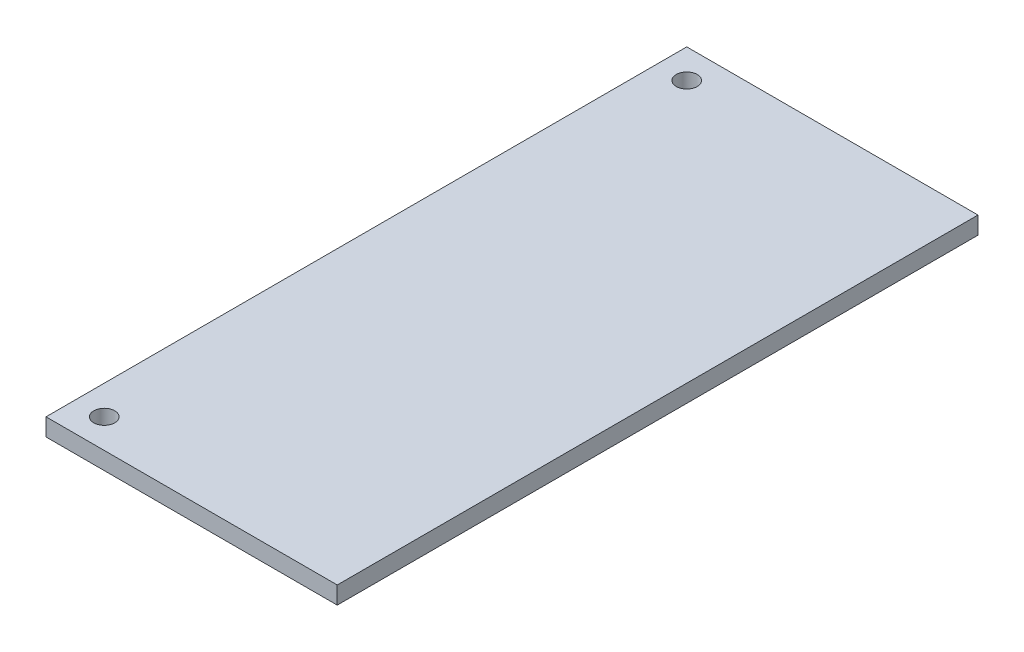
ISO-10303-21;
HEADER;
FILE_DESCRIPTION(('STEP AP214'),'2;1');
FILE_NAME('part.step','',(''),(''),'','','');
FILE_SCHEMA(('AUTOMOTIVE_DESIGN { 1 0 10303 214 1 1 1 1 }'));
ENDSEC;
DATA;
#1=APPLICATION_CONTEXT('core data for automotive mechanical design processes');
#2=APPLICATION_PROTOCOL_DEFINITION('international standard','automotive_design',2000,#1);
#3=PRODUCT_CONTEXT('',#1,'mechanical');
#4=PRODUCT('Part','Part','',(#3));
#5=PRODUCT_RELATED_PRODUCT_CATEGORY('part','',(#4));
#6=PRODUCT_DEFINITION_FORMATION('','',#4);
#7=PRODUCT_DEFINITION_CONTEXT('part definition',#1,'design');
#8=PRODUCT_DEFINITION('design','',#6,#7);
#9=PRODUCT_DEFINITION_SHAPE('','',#8);
#10=(LENGTH_UNIT() NAMED_UNIT(*) SI_UNIT(.MILLI.,.METRE.));
#11=(NAMED_UNIT(*) PLANE_ANGLE_UNIT() SI_UNIT($,.RADIAN.));
#12=(NAMED_UNIT(*) SI_UNIT($,.STERADIAN.) SOLID_ANGLE_UNIT());
#13=UNCERTAINTY_MEASURE_WITH_UNIT(LENGTH_MEASURE(1.E-05),#10,'distance_accuracy_value','');
#14=(GEOMETRIC_REPRESENTATION_CONTEXT(3) GLOBAL_UNCERTAINTY_ASSIGNED_CONTEXT((#13)) GLOBAL_UNIT_ASSIGNED_CONTEXT((#10,
#11,#12)) REPRESENTATION_CONTEXT('',''));
#15=CARTESIAN_POINT('',(0.,0.,0.));
#16=DIRECTION('',(0.,0.,1.));
#17=DIRECTION('',(1.,0.,0.));
#18=AXIS2_PLACEMENT_3D('',#15,#16,#17);
#19=CARTESIAN_POINT('',(25.0000000000008,3.,55.));
#20=DIRECTION('',(-1.,0.,0.));
#21=DIRECTION('',(0.,0.,1.));
#22=AXIS2_PLACEMENT_3D('',#19,#20,#21);
#23=PLANE('',#22);
#24=DIRECTION('',(0.,0.,-1.));
#25=VECTOR('',#24,1.);
#26=CARTESIAN_POINT('',(25.0000000000008,0.,55.));
#27=LINE('',#26,#25);
#28=CARTESIAN_POINT('',(25.0000000000008,0.,55.));
#29=VERTEX_POINT('',#28);
#30=CARTESIAN_POINT('',(25.0000000000008,0.,-55.));
#31=VERTEX_POINT('',#30);
#32=EDGE_CURVE('E104',#29,#31,#27,.T.);
#33=ORIENTED_EDGE('',*,*,#32,.T.);
#34=DIRECTION('',(0.,-1.,0.));
#35=VECTOR('',#34,1.);
#36=CARTESIAN_POINT('',(25.0000000000008,3.,-55.));
#37=LINE('',#36,#35);
#38=CARTESIAN_POINT('',(25.0000000000008,3.,-55.));
#39=VERTEX_POINT('',#38);
#40=EDGE_CURVE('E11',#39,#31,#37,.T.);
#41=ORIENTED_EDGE('',*,*,#40,.F.);
#42=DIRECTION('',(0.,0.,-1.));
#43=VECTOR('',#42,1.);
#44=CARTESIAN_POINT('',(25.0000000000008,3.,55.));
#45=LINE('',#44,#43);
#46=CARTESIAN_POINT('',(25.0000000000008,3.,55.));
#47=VERTEX_POINT('',#46);
#48=EDGE_CURVE('E91',#47,#39,#45,.T.);
#49=ORIENTED_EDGE('',*,*,#48,.F.);
#50=DIRECTION('',(0.,-1.,0.));
#51=VECTOR('',#50,1.);
#52=CARTESIAN_POINT('',(25.0000000000008,3.,55.));
#53=LINE('',#52,#51);
#54=EDGE_CURVE('E100',#47,#29,#53,.T.);
#55=ORIENTED_EDGE('',*,*,#54,.T.);
#56=EDGE_LOOP('',(#33,#41,#49,#55));
#57=FACE_BOUND('',#56,.T.);
#58=ADVANCED_FACE('F39',(#57),#23,.F.);
#59=CARTESIAN_POINT('',(-24.999999999999,3.,-55.));
#60=DIRECTION('',(0.,0.,1.));
#61=DIRECTION('',(1.,0.,0.));
#62=AXIS2_PLACEMENT_3D('',#59,#60,#61);
#63=PLANE('',#62);
#64=DIRECTION('',(-1.,0.,0.));
#65=VECTOR('',#64,1.);
#66=CARTESIAN_POINT('',(-24.999999999999,0.,-55.));
#67=LINE('',#66,#65);
#68=CARTESIAN_POINT('',(-24.999999999999,0.,-55.));
#69=VERTEX_POINT('',#68);
#70=EDGE_CURVE('E95',#31,#69,#67,.T.);
#71=ORIENTED_EDGE('',*,*,#70,.T.);
#72=DIRECTION('',(0.,-1.,0.));
#73=VECTOR('',#72,1.);
#74=CARTESIAN_POINT('',(-24.999999999999,3.,-55.));
#75=LINE('',#74,#73);
#76=CARTESIAN_POINT('',(-24.999999999999,3.,-55.));
#77=VERTEX_POINT('',#76);
#78=EDGE_CURVE('E48',#77,#69,#75,.T.);
#79=ORIENTED_EDGE('',*,*,#78,.F.);
#80=DIRECTION('',(-1.,0.,0.));
#81=VECTOR('',#80,1.);
#82=CARTESIAN_POINT('',(-24.999999999999,3.,-55.));
#83=LINE('',#82,#81);
#84=EDGE_CURVE('E86',#39,#77,#83,.T.);
#85=ORIENTED_EDGE('',*,*,#84,.F.);
#86=ORIENTED_EDGE('',*,*,#40,.T.);
#87=EDGE_LOOP('',(#71,#79,#85,#86));
#88=FACE_BOUND('',#87,.T.);
#89=ADVANCED_FACE('F94',(#88),#63,.F.);
#90=CARTESIAN_POINT('',(-24.999999999999,3.,55.));
#91=DIRECTION('',(1.,0.,0.));
#92=DIRECTION('',(0.,0.,-1.));
#93=AXIS2_PLACEMENT_3D('',#90,#91,#92);
#94=PLANE('',#93);
#95=DIRECTION('',(0.,0.,1.));
#96=VECTOR('',#95,1.);
#97=CARTESIAN_POINT('',(-24.999999999999,0.,55.));
#98=LINE('',#97,#96);
#99=CARTESIAN_POINT('',(-24.999999999999,0.,55.));
#100=VERTEX_POINT('',#99);
#101=EDGE_CURVE('E73',#69,#100,#98,.T.);
#102=ORIENTED_EDGE('',*,*,#101,.T.);
#103=DIRECTION('',(0.,-1.,0.));
#104=VECTOR('',#103,1.);
#105=CARTESIAN_POINT('',(-24.999999999999,3.,55.));
#106=LINE('',#105,#104);
#107=CARTESIAN_POINT('',(-24.999999999999,3.,55.));
#108=VERTEX_POINT('',#107);
#109=EDGE_CURVE('E96',#108,#100,#106,.T.);
#110=ORIENTED_EDGE('',*,*,#109,.F.);
#111=DIRECTION('',(0.,0.,1.));
#112=VECTOR('',#111,1.);
#113=CARTESIAN_POINT('',(-24.999999999999,3.,55.));
#114=LINE('',#113,#112);
#115=EDGE_CURVE('E89',#77,#108,#114,.T.);
#116=ORIENTED_EDGE('',*,*,#115,.F.);
#117=ORIENTED_EDGE('',*,*,#78,.T.);
#118=EDGE_LOOP('',(#102,#110,#116,#117));
#119=FACE_BOUND('',#118,.T.);
#120=ADVANCED_FACE('F98',(#119),#94,.F.);
#121=CARTESIAN_POINT('',(-24.999999999999,3.,55.));
#122=DIRECTION('',(0.,0.,-1.));
#123=DIRECTION('',(-1.,0.,0.));
#124=AXIS2_PLACEMENT_3D('',#121,#122,#123);
#125=PLANE('',#124);
#126=DIRECTION('',(1.,0.,0.));
#127=VECTOR('',#126,1.);
#128=CARTESIAN_POINT('',(-24.999999999999,0.,55.));
#129=LINE('',#128,#127);
#130=EDGE_CURVE('E79',#100,#29,#129,.T.);
#131=ORIENTED_EDGE('',*,*,#130,.T.);
#132=ORIENTED_EDGE('',*,*,#54,.F.);
#133=DIRECTION('',(1.,0.,0.));
#134=VECTOR('',#133,1.);
#135=CARTESIAN_POINT('',(-24.999999999999,3.,55.));
#136=LINE('',#135,#134);
#137=EDGE_CURVE('E56',#108,#47,#136,.T.);
#138=ORIENTED_EDGE('',*,*,#137,.F.);
#139=ORIENTED_EDGE('',*,*,#109,.T.);
#140=EDGE_LOOP('',(#131,#132,#138,#139));
#141=FACE_BOUND('',#140,.T.);
#142=ADVANCED_FACE('F112',(#141),#125,.F.);
#143=CARTESIAN_POINT('',(0.,3.,0.));
#144=DIRECTION('',(0.,-1.,0.));
#145=DIRECTION('',(0.,0.,-1.));
#146=AXIS2_PLACEMENT_3D('',#143,#144,#145);
#147=PLANE('',#146);
#148=CARTESIAN_POINT('',(-19.999999999999,3.,-50.));
#149=DIRECTION('',(0.,1.,0.));
#150=DIRECTION('',(0.,0.,1.));
#151=AXIS2_PLACEMENT_3D('',#148,#149,#150);
#152=CIRCLE('',#151,1.8);
#153=CARTESIAN_POINT('',(-19.999999999999,3.,-48.2));
#154=VERTEX_POINT('',#153);
#155=EDGE_CURVE('E123',#154,#154,#152,.T.);
#156=ORIENTED_EDGE('',*,*,#155,.F.);
#157=EDGE_LOOP('',(#156));
#158=FACE_BOUND('',#157,.T.);
#159=CARTESIAN_POINT('',(-19.999999999999,3.,50.));
#160=DIRECTION('',(0.,1.,0.));
#161=DIRECTION('',(0.,0.,1.));
#162=AXIS2_PLACEMENT_3D('',#159,#160,#161);
#163=CIRCLE('',#162,1.8);
#164=CARTESIAN_POINT('',(-19.999999999999,3.,51.8));
#165=VERTEX_POINT('',#164);
#166=EDGE_CURVE('E120',#165,#165,#163,.T.);
#167=ORIENTED_EDGE('',*,*,#166,.F.);
#168=EDGE_LOOP('',(#167));
#169=FACE_BOUND('',#168,.T.);
#170=ORIENTED_EDGE('',*,*,#48,.T.);
#171=ORIENTED_EDGE('',*,*,#84,.T.);
#172=ORIENTED_EDGE('',*,*,#115,.T.);
#173=ORIENTED_EDGE('',*,*,#137,.T.);
#174=EDGE_LOOP('',(#170,#171,#172,#173));
#175=FACE_BOUND('',#174,.T.);
#176=ADVANCED_FACE('F87',(#158,#169,#175),#147,.F.);
#177=CARTESIAN_POINT('',(0.,0.,0.));
#178=DIRECTION('',(0.,-1.,0.));
#179=DIRECTION('',(0.,0.,-1.));
#180=AXIS2_PLACEMENT_3D('',#177,#178,#179);
#181=PLANE('',#180);
#182=CARTESIAN_POINT('',(-19.999999999999,0.,-50.));
#183=DIRECTION('',(0.,-1.,0.));
#184=DIRECTION('',(0.,0.,-1.));
#185=AXIS2_PLACEMENT_3D('',#182,#183,#184);
#186=CIRCLE('',#185,1.8);
#187=CARTESIAN_POINT('',(-19.999999999999,0.,-51.8));
#188=VERTEX_POINT('',#187);
#189=EDGE_CURVE('E42',#188,#188,#186,.T.);
#190=ORIENTED_EDGE('',*,*,#189,.F.);
#191=EDGE_LOOP('',(#190));
#192=FACE_BOUND('',#191,.T.);
#193=CARTESIAN_POINT('',(-19.999999999999,0.,50.));
#194=DIRECTION('',(0.,-1.,0.));
#195=DIRECTION('',(0.,0.,-1.));
#196=AXIS2_PLACEMENT_3D('',#193,#194,#195);
#197=CIRCLE('',#196,1.8);
#198=CARTESIAN_POINT('',(-19.999999999999,0.,48.2));
#199=VERTEX_POINT('',#198);
#200=EDGE_CURVE('E107',#199,#199,#197,.T.);
#201=ORIENTED_EDGE('',*,*,#200,.F.);
#202=EDGE_LOOP('',(#201));
#203=FACE_BOUND('',#202,.T.);
#204=ORIENTED_EDGE('',*,*,#32,.F.);
#205=ORIENTED_EDGE('',*,*,#130,.F.);
#206=ORIENTED_EDGE('',*,*,#101,.F.);
#207=ORIENTED_EDGE('',*,*,#70,.F.);
#208=EDGE_LOOP('',(#204,#205,#206,#207));
#209=FACE_BOUND('',#208,.T.);
#210=ADVANCED_FACE('F115',(#192,#203,#209),#181,.T.);
#211=CARTESIAN_POINT('',(-19.999999999999,3.,50.));
#212=DIRECTION('',(0.,1.,0.));
#213=DIRECTION('',(0.,0.,1.));
#214=AXIS2_PLACEMENT_3D('',#211,#212,#213);
#215=CYLINDRICAL_SURFACE('',#214,1.8);
#216=ORIENTED_EDGE('',*,*,#200,.T.);
#217=EDGE_LOOP('',(#216));
#218=FACE_BOUND('',#217,.T.);
#219=ORIENTED_EDGE('',*,*,#166,.T.);
#220=EDGE_LOOP('',(#219));
#221=FACE_BOUND('',#220,.T.);
#222=ADVANCED_FACE('F134',(#218,#221),#215,.F.);
#223=CARTESIAN_POINT('',(-19.999999999999,3.,-50.));
#224=DIRECTION('',(0.,1.,0.));
#225=DIRECTION('',(0.,0.,1.));
#226=AXIS2_PLACEMENT_3D('',#223,#224,#225);
#227=CYLINDRICAL_SURFACE('',#226,1.8);
#228=ORIENTED_EDGE('',*,*,#189,.T.);
#229=EDGE_LOOP('',(#228));
#230=FACE_BOUND('',#229,.T.);
#231=ORIENTED_EDGE('',*,*,#155,.T.);
#232=EDGE_LOOP('',(#231));
#233=FACE_BOUND('',#232,.T.);
#234=ADVANCED_FACE('F130',(#230,#233),#227,.F.);
#235=CLOSED_SHELL('',(#58,#89,#120,#142,#176,#210,#222,#234));
#236=MANIFOLD_SOLID_BREP('B2',#235);
#237=ADVANCED_BREP_SHAPE_REPRESENTATION('',(#18,#236),#14);
#238=SHAPE_DEFINITION_REPRESENTATION(#9,#237);
ENDSEC;
END-ISO-10303-21;
